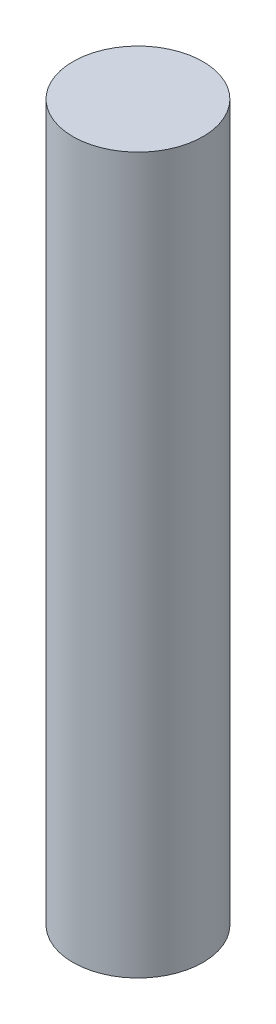
ISO-10303-21;
HEADER;
FILE_DESCRIPTION(('STEP AP214'),'2;1');
FILE_NAME('part.step','',(''),(''),'','','');
FILE_SCHEMA(('AUTOMOTIVE_DESIGN { 1 0 10303 214 1 1 1 1 }'));
ENDSEC;
DATA;
#1=APPLICATION_CONTEXT('core data for automotive mechanical design processes');
#2=APPLICATION_PROTOCOL_DEFINITION('international standard','automotive_design',2000,#1);
#3=PRODUCT_CONTEXT('',#1,'mechanical');
#4=PRODUCT('Part','Part','',(#3));
#5=PRODUCT_RELATED_PRODUCT_CATEGORY('part','',(#4));
#6=PRODUCT_DEFINITION_FORMATION('','',#4);
#7=PRODUCT_DEFINITION_CONTEXT('part definition',#1,'design');
#8=PRODUCT_DEFINITION('design','',#6,#7);
#9=PRODUCT_DEFINITION_SHAPE('','',#8);
#10=(LENGTH_UNIT() NAMED_UNIT(*) SI_UNIT(.MILLI.,.METRE.));
#11=(NAMED_UNIT(*) PLANE_ANGLE_UNIT() SI_UNIT($,.RADIAN.));
#12=(NAMED_UNIT(*) SI_UNIT($,.STERADIAN.) SOLID_ANGLE_UNIT());
#13=UNCERTAINTY_MEASURE_WITH_UNIT(LENGTH_MEASURE(1.E-05),#10,'distance_accuracy_value','');
#14=(GEOMETRIC_REPRESENTATION_CONTEXT(3) GLOBAL_UNCERTAINTY_ASSIGNED_CONTEXT((#13)) GLOBAL_UNIT_ASSIGNED_CONTEXT((#10,
#11,#12)) REPRESENTATION_CONTEXT('',''));
#15=CARTESIAN_POINT('',(0.,0.,0.));
#16=DIRECTION('',(0.,0.,1.));
#17=DIRECTION('',(1.,0.,0.));
#18=AXIS2_PLACEMENT_3D('',#15,#16,#17);
#19=CARTESIAN_POINT('',(335.,-32.5,589.615242270663));
#20=DIRECTION('',(0.,1.,0.));
#21=DIRECTION('',(0.,0.,1.));
#22=AXIS2_PLACEMENT_3D('',#19,#20,#21);
#23=CYLINDRICAL_SURFACE('',#22,2.49999999999995);
#24=CARTESIAN_POINT('',(335.,-32.5,589.615242270663));
#25=DIRECTION('',(0.,-1.,0.));
#26=DIRECTION('',(0.,0.,-1.));
#27=AXIS2_PLACEMENT_3D('',#24,#25,#26);
#28=CIRCLE('',#27,2.49999999999995);
#29=CARTESIAN_POINT('',(335.,-32.5,592.115242270663));
#30=VERTEX_POINT('',#29);
#31=EDGE_CURVE('E10',#30,#30,#28,.F.);
#32=CARTESIAN_POINT('',(335.,-5.,589.615242270663));
#33=DIRECTION('',(0.,-1.,0.));
#34=DIRECTION('',(0.,0.,-1.));
#35=AXIS2_PLACEMENT_3D('',#32,#33,#34);
#36=CIRCLE('',#35,2.49999999999995);
#37=CARTESIAN_POINT('',(335.,-5.,592.115242270663));
#38=VERTEX_POINT('',#37);
#39=EDGE_CURVE('E39',#38,#38,#36,.F.);
#40=CARTESIAN_POINT('',(335.,-32.5,592.115242270663));
#41=CARTESIAN_POINT('',(335.,-32.2135416666667,592.115242270663));
#42=CARTESIAN_POINT('',(335.,-31.9270833333333,592.115242270663));
#43=CARTESIAN_POINT('',(335.,-31.3541666666667,592.115242270663));
#44=CARTESIAN_POINT('',(335.,-31.0677083333333,592.115242270663));
#45=CARTESIAN_POINT('',(335.,-30.4947916666667,592.115242270663));
#46=CARTESIAN_POINT('',(335.,-30.2083333333333,592.115242270663));
#47=CARTESIAN_POINT('',(335.,-29.6354166666667,592.115242270663));
#48=CARTESIAN_POINT('',(335.,-29.3489583333333,592.115242270663));
#49=CARTESIAN_POINT('',(335.,-28.7760416666667,592.115242270663));
#50=CARTESIAN_POINT('',(335.,-28.4895833333333,592.115242270663));
#51=CARTESIAN_POINT('',(335.,-27.9166666666667,592.115242270663));
#52=CARTESIAN_POINT('',(335.,-27.6302083333333,592.115242270663));
#53=CARTESIAN_POINT('',(335.,-27.0572916666667,592.115242270663));
#54=CARTESIAN_POINT('',(335.,-26.7708333333333,592.115242270663));
#55=CARTESIAN_POINT('',(335.,-26.1979166666667,592.115242270663));
#56=CARTESIAN_POINT('',(335.,-25.9114583333333,592.115242270663));
#57=CARTESIAN_POINT('',(335.,-25.3385416666667,592.115242270663));
#58=CARTESIAN_POINT('',(335.,-25.0520833333333,592.115242270663));
#59=CARTESIAN_POINT('',(335.,-24.4791666666667,592.115242270663));
#60=CARTESIAN_POINT('',(335.,-24.1927083333333,592.115242270663));
#61=CARTESIAN_POINT('',(335.,-23.6197916666667,592.115242270663));
#62=CARTESIAN_POINT('',(335.,-23.3333333333333,592.115242270663));
#63=CARTESIAN_POINT('',(335.,-22.7604166666667,592.115242270663));
#64=CARTESIAN_POINT('',(335.,-22.4739583333333,592.115242270663));
#65=CARTESIAN_POINT('',(335.,-21.9010416666667,592.115242270663));
#66=CARTESIAN_POINT('',(335.,-21.6145833333333,592.115242270663));
#67=CARTESIAN_POINT('',(335.,-21.0416666666667,592.115242270663));
#68=CARTESIAN_POINT('',(335.,-20.7552083333333,592.115242270663));
#69=CARTESIAN_POINT('',(335.,-20.1822916666667,592.115242270663));
#70=CARTESIAN_POINT('',(335.,-19.8958333333333,592.115242270663));
#71=CARTESIAN_POINT('',(335.,-19.3229166666667,592.115242270663));
#72=CARTESIAN_POINT('',(335.,-19.0364583333333,592.115242270663));
#73=CARTESIAN_POINT('',(335.,-18.4635416666667,592.115242270663));
#74=CARTESIAN_POINT('',(335.,-18.1770833333333,592.115242270663));
#75=CARTESIAN_POINT('',(335.,-17.6041666666667,592.115242270663));
#76=CARTESIAN_POINT('',(335.,-17.3177083333333,592.115242270663));
#77=CARTESIAN_POINT('',(335.,-16.7447916666667,592.115242270663));
#78=CARTESIAN_POINT('',(335.,-16.4583333333333,592.115242270663));
#79=CARTESIAN_POINT('',(335.,-15.8854166666667,592.115242270663));
#80=CARTESIAN_POINT('',(335.,-15.5989583333333,592.115242270663));
#81=CARTESIAN_POINT('',(335.,-15.0260416666667,592.115242270663));
#82=CARTESIAN_POINT('',(335.,-14.7395833333333,592.115242270663));
#83=CARTESIAN_POINT('',(335.,-14.1666666666667,592.115242270663));
#84=CARTESIAN_POINT('',(335.,-13.8802083333333,592.115242270663));
#85=CARTESIAN_POINT('',(335.,-13.3072916666667,592.115242270663));
#86=CARTESIAN_POINT('',(335.,-13.0208333333333,592.115242270663));
#87=CARTESIAN_POINT('',(335.,-12.4479166666667,592.115242270663));
#88=CARTESIAN_POINT('',(335.,-12.1614583333333,592.115242270663));
#89=CARTESIAN_POINT('',(335.,-11.5885416666667,592.115242270663));
#90=CARTESIAN_POINT('',(335.,-11.3020833333333,592.115242270663));
#91=CARTESIAN_POINT('',(335.,-10.7291666666667,592.115242270663));
#92=CARTESIAN_POINT('',(335.,-10.4427083333333,592.115242270663));
#93=CARTESIAN_POINT('',(335.,-9.86979166666667,592.115242270663));
#94=CARTESIAN_POINT('',(335.,-9.58333333333333,592.115242270663));
#95=CARTESIAN_POINT('',(335.,-9.01041666666667,592.115242270663));
#96=CARTESIAN_POINT('',(335.,-8.72395833333333,592.115242270663));
#97=CARTESIAN_POINT('',(335.,-8.15104166666667,592.115242270663));
#98=CARTESIAN_POINT('',(335.,-7.86458333333333,592.115242270663));
#99=CARTESIAN_POINT('',(335.,-7.29166666666667,592.115242270663));
#100=CARTESIAN_POINT('',(335.,-7.00520833333334,592.115242270663));
#101=CARTESIAN_POINT('',(335.,-6.43229166666667,592.115242270663));
#102=CARTESIAN_POINT('',(335.,-6.14583333333333,592.115242270663));
#103=CARTESIAN_POINT('',(335.,-5.57291666666667,592.115242270663));
#104=CARTESIAN_POINT('',(335.,-5.28645833333333,592.115242270663));
#105=CARTESIAN_POINT('',(335.,-5.,592.115242270663));
#106=B_SPLINE_CURVE_WITH_KNOTS('',3,(#40,#41,#42,#43,#44,#45,#46,#47,#48,#49,#50,#51,#52,#53,
#54,#55,#56,#57,#58,#59,#60,#61,#62,#63,#64,#65,#66,#67,#68,#69,#70,#71,#72,#73,#74,#75,#76,#77,
#78,#79,#80,#81,#82,#83,#84,#85,#86,#87,#88,#89,#90,#91,#92,#93,#94,#95,#96,#97,#98,#99,#100,
#101,#102,#103,#104,#105),.UNSPECIFIED.,.F.,.F.,(4,2,2,2,2,2,2,2,2,2,2,2,2,2,2,2,2,2,2,2,2,2,2,
2,2,2,2,2,2,2,2,2,4),(0.,0.859374999999996,1.71875,2.578125,3.4375,4.296875,5.15624999999999,
6.015625,6.875,7.73437499999999,8.59375,9.45312499999999,10.3125,11.171875,12.03125,12.890625,
13.75,14.609375,15.46875,16.328125,17.1875,18.046875,18.90625,19.765625,20.625,21.484375,
22.34375,23.203125,24.0625,24.921875,25.78125,26.640625,27.5),.UNSPECIFIED.);
#107=EDGE_CURVE('BSEAM33',#30,#38,#106,.T.);
#108=ORIENTED_EDGE('',*,*,#31,.T.);
#109=ORIENTED_EDGE('',*,*,#39,.F.);
#110=ORIENTED_EDGE('',*,*,#107,.T.);
#111=ORIENTED_EDGE('',*,*,#107,.F.);
#112=EDGE_LOOP('',(#108,#110,#109,#111));
#113=FACE_BOUND('',#112,.T.);
#114=ADVANCED_FACE('F33',(#113),#23,.T.);
#115=CARTESIAN_POINT('',(0.,-32.5,0.));
#116=DIRECTION('',(0.,-1.,0.));
#117=DIRECTION('',(0.,0.,-1.));
#118=AXIS2_PLACEMENT_3D('',#115,#116,#117);
#119=PLANE('',#118);
#120=ORIENTED_EDGE('',*,*,#31,.F.);
#121=EDGE_LOOP('',(#120));
#122=FACE_BOUND('',#121,.T.);
#123=ADVANCED_FACE('F48',(#122),#119,.T.);
#124=CARTESIAN_POINT('',(0.,-5.,0.));
#125=DIRECTION('',(0.,-1.,0.));
#126=DIRECTION('',(0.,0.,-1.));
#127=AXIS2_PLACEMENT_3D('',#124,#125,#126);
#128=PLANE('',#127);
#129=ORIENTED_EDGE('',*,*,#39,.T.);
#130=EDGE_LOOP('',(#129));
#131=FACE_BOUND('',#130,.T.);
#132=ADVANCED_FACE('F45',(#131),#128,.F.);
#133=CLOSED_SHELL('',(#114,#123,#132));
#134=MANIFOLD_SOLID_BREP('B2',#133);
#135=ADVANCED_BREP_SHAPE_REPRESENTATION('',(#18,#134),#14);
#136=SHAPE_DEFINITION_REPRESENTATION(#9,#135);
ENDSEC;
END-ISO-10303-21;
